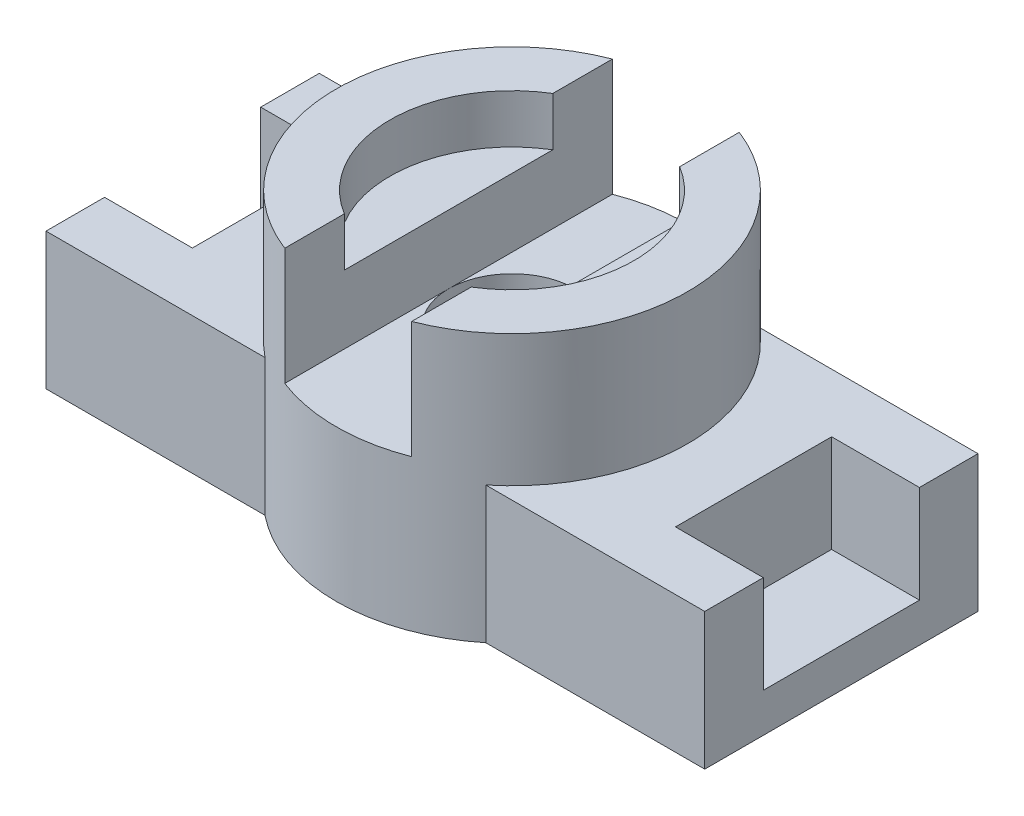
ISO-10303-21;
HEADER;
FILE_DESCRIPTION(('STEP AP214'),'2;1');
FILE_NAME('part.step','',(''),(''),'','','');
FILE_SCHEMA(('AUTOMOTIVE_DESIGN { 1 0 10303 214 1 1 1 1 }'));
ENDSEC;
DATA;
#1=APPLICATION_CONTEXT('core data for automotive mechanical design processes');
#2=APPLICATION_PROTOCOL_DEFINITION('international standard','automotive_design',2000,#1);
#3=PRODUCT_CONTEXT('',#1,'mechanical');
#4=PRODUCT('Part','Part','',(#3));
#5=PRODUCT_RELATED_PRODUCT_CATEGORY('part','',(#4));
#6=PRODUCT_DEFINITION_FORMATION('','',#4);
#7=PRODUCT_DEFINITION_CONTEXT('part definition',#1,'design');
#8=PRODUCT_DEFINITION('design','',#6,#7);
#9=PRODUCT_DEFINITION_SHAPE('','',#8);
#10=(LENGTH_UNIT() NAMED_UNIT(*) SI_UNIT(.MILLI.,.METRE.));
#11=(NAMED_UNIT(*) PLANE_ANGLE_UNIT() SI_UNIT($,.RADIAN.));
#12=(NAMED_UNIT(*) SI_UNIT($,.STERADIAN.) SOLID_ANGLE_UNIT());
#13=UNCERTAINTY_MEASURE_WITH_UNIT(LENGTH_MEASURE(1.E-05),#10,'distance_accuracy_value','');
#14=(GEOMETRIC_REPRESENTATION_CONTEXT(3) GLOBAL_UNCERTAINTY_ASSIGNED_CONTEXT((#13)) GLOBAL_UNIT_ASSIGNED_CONTEXT((#10,
#11,#12)) REPRESENTATION_CONTEXT('',''));
#15=CARTESIAN_POINT('',(0.,0.,0.));
#16=DIRECTION('',(0.,0.,1.));
#17=DIRECTION('',(1.,0.,0.));
#18=AXIS2_PLACEMENT_3D('',#15,#16,#17);
#19=CARTESIAN_POINT('',(0.,55.,0.));
#20=DIRECTION('',(0.,-1.,0.));
#21=DIRECTION('',(0.,0.,-1.));
#22=AXIS2_PLACEMENT_3D('',#19,#20,#21);
#23=CYLINDRICAL_SURFACE('',#22,13.);
#24=CARTESIAN_POINT('',(0.,0.,0.));
#25=DIRECTION('',(0.,1.,0.));
#26=DIRECTION('',(0.,0.,1.));
#27=AXIS2_PLACEMENT_3D('',#24,#25,#26);
#28=CIRCLE('',#27,13.);
#29=CARTESIAN_POINT('',(0.,0.,13.));
#30=VERTEX_POINT('',#29);
#31=EDGE_CURVE('E374',#30,#30,#28,.T.);
#32=ORIENTED_EDGE('',*,*,#31,.F.);
#33=EDGE_LOOP('',(#32));
#34=FACE_BOUND('',#33,.T.);
#35=CARTESIAN_POINT('',(0.,31.,0.));
#36=DIRECTION('',(0.,1.,0.));
#37=DIRECTION('',(0.,0.,1.));
#38=AXIS2_PLACEMENT_3D('',#35,#36,#37);
#39=CIRCLE('',#38,13.);
#40=CARTESIAN_POINT('',(-13.,31.,0.));
#41=VERTEX_POINT('',#40);
#42=CARTESIAN_POINT('',(13.,31.,0.));
#43=VERTEX_POINT('',#42);
#44=EDGE_CURVE('E365',#41,#43,#39,.T.);
#45=ORIENTED_EDGE('',*,*,#44,.T.);
#46=EDGE_CURVE('E369',#43,#41,#39,.T.);
#47=ORIENTED_EDGE('',*,*,#46,.T.);
#48=EDGE_LOOP('',(#45,#47));
#49=FACE_BOUND('',#48,.T.);
#50=ADVANCED_FACE('F80',(#34,#49),#23,.F.);
#51=CARTESIAN_POINT('',(0.,55.,0.));
#52=DIRECTION('',(0.,1.,0.));
#53=DIRECTION('',(0.,0.,1.));
#54=AXIS2_PLACEMENT_3D('',#51,#52,#53);
#55=PLANE('',#54);
#56=CARTESIAN_POINT('',(0.,55.,0.));
#57=DIRECTION('',(0.,1.,0.));
#58=DIRECTION('',(0.,0.,1.));
#59=AXIS2_PLACEMENT_3D('',#56,#57,#58);
#60=CIRCLE('',#59,36.);
#61=CARTESIAN_POINT('',(-13.,55.,-33.570820663189));
#62=VERTEX_POINT('',#61);
#63=CARTESIAN_POINT('',(-13.,55.,33.570820663189));
#64=VERTEX_POINT('',#63);
#65=EDGE_CURVE('E431',#62,#64,#60,.T.);
#66=ORIENTED_EDGE('',*,*,#65,.T.);
#67=DIRECTION('',(0.,0.,-1.));
#68=VECTOR('',#67,1.);
#69=CARTESIAN_POINT('',(-13.,55.,0.));
#70=LINE('',#69,#68);
#71=CARTESIAN_POINT('',(-13.,55.,21.3541565040626));
#72=VERTEX_POINT('',#71);
#73=EDGE_CURVE('E333',#64,#72,#70,.T.);
#74=ORIENTED_EDGE('',*,*,#73,.T.);
#75=CARTESIAN_POINT('',(0.,55.,0.));
#76=DIRECTION('',(0.,1.,0.));
#77=DIRECTION('',(0.,0.,1.));
#78=AXIS2_PLACEMENT_3D('',#75,#76,#77);
#79=CIRCLE('',#78,25.);
#80=CARTESIAN_POINT('',(-13.,55.,-21.3541565040626));
#81=VERTEX_POINT('',#80);
#82=EDGE_CURVE('E380',#81,#72,#79,.T.);
#83=ORIENTED_EDGE('',*,*,#82,.F.);
#84=EDGE_CURVE('E318',#81,#62,#70,.T.);
#85=ORIENTED_EDGE('',*,*,#84,.T.);
#86=EDGE_LOOP('',(#66,#74,#83,#85));
#87=FACE_BOUND('',#86,.T.);
#88=ADVANCED_FACE('F556',(#87),#55,.T.);
#89=CARTESIAN_POINT('',(0.,45.,0.));
#90=DIRECTION('',(0.,1.,0.));
#91=DIRECTION('',(0.,0.,1.));
#92=AXIS2_PLACEMENT_3D('',#89,#90,#91);
#93=CYLINDRICAL_SURFACE('',#92,25.);
#94=DIRECTION('',(0.,1.,0.));
#95=VECTOR('',#94,1.);
#96=CARTESIAN_POINT('',(-13.,45.,-21.3541565040626));
#97=LINE('',#96,#95);
#98=CARTESIAN_POINT('',(-13.,45.,-21.3541565040626));
#99=VERTEX_POINT('',#98);
#100=EDGE_CURVE('E340',#81,#99,#97,.F.);
#101=ORIENTED_EDGE('',*,*,#100,.F.);
#102=ORIENTED_EDGE('',*,*,#82,.T.);
#103=DIRECTION('',(0.,1.,0.));
#104=VECTOR('',#103,1.);
#105=CARTESIAN_POINT('',(-13.,45.,21.3541565040626));
#106=LINE('',#105,#104);
#107=CARTESIAN_POINT('',(-13.,45.,21.3541565040626));
#108=VERTEX_POINT('',#107);
#109=EDGE_CURVE('E337',#108,#72,#106,.T.);
#110=ORIENTED_EDGE('',*,*,#109,.F.);
#111=CARTESIAN_POINT('',(0.,45.,0.));
#112=DIRECTION('',(0.,1.,0.));
#113=DIRECTION('',(0.,0.,1.));
#114=AXIS2_PLACEMENT_3D('',#111,#112,#113);
#115=CIRCLE('',#114,25.);
#116=EDGE_CURVE('E375',#99,#108,#115,.T.);
#117=ORIENTED_EDGE('',*,*,#116,.F.);
#118=EDGE_LOOP('',(#101,#102,#110,#117));
#119=FACE_BOUND('',#118,.T.);
#120=ADVANCED_FACE('F563',(#119),#93,.F.);
#121=CARTESIAN_POINT('',(0.,45.,0.));
#122=DIRECTION('',(0.,1.,0.));
#123=DIRECTION('',(0.,0.,1.));
#124=AXIS2_PLACEMENT_3D('',#121,#122,#123);
#125=PLANE('',#124);
#126=ORIENTED_EDGE('',*,*,#116,.T.);
#127=DIRECTION('',(0.,0.,-1.));
#128=VECTOR('',#127,1.);
#129=CARTESIAN_POINT('',(-13.,45.,0.));
#130=LINE('',#129,#128);
#131=EDGE_CURVE('E476',#108,#99,#130,.T.);
#132=ORIENTED_EDGE('',*,*,#131,.T.);
#133=EDGE_LOOP('',(#126,#132));
#134=FACE_BOUND('',#133,.T.);
#135=ADVANCED_FACE('F567',(#134),#125,.T.);
#136=CARTESIAN_POINT('',(0.,55.,0.));
#137=DIRECTION('',(0.,-1.,0.));
#138=DIRECTION('',(0.,0.,-1.));
#139=AXIS2_PLACEMENT_3D('',#136,#137,#138);
#140=CYLINDRICAL_SURFACE('',#139,36.);
#141=CARTESIAN_POINT('',(0.,31.,0.));
#142=DIRECTION('',(0.,1.,0.));
#143=DIRECTION('',(0.,0.,1.));
#144=AXIS2_PLACEMENT_3D('',#141,#142,#143);
#145=CIRCLE('',#144,36.);
#146=CARTESIAN_POINT('',(13.,31.,-33.570820663189));
#147=VERTEX_POINT('',#146);
#148=CARTESIAN_POINT('',(-13.,31.,-33.570820663189));
#149=VERTEX_POINT('',#148);
#150=EDGE_CURVE('E486',#147,#149,#145,.T.);
#151=ORIENTED_EDGE('',*,*,#150,.F.);
#152=DIRECTION('',(0.,-1.,0.));
#153=VECTOR('',#152,1.);
#154=CARTESIAN_POINT('',(13.,55.,-33.570820663189));
#155=LINE('',#154,#153);
#156=CARTESIAN_POINT('',(13.,55.,-33.570820663189));
#157=VERTEX_POINT('',#156);
#158=EDGE_CURVE('E357',#147,#157,#155,.F.);
#159=ORIENTED_EDGE('',*,*,#158,.T.);
#160=CARTESIAN_POINT('',(13.,55.,33.570820663189));
#161=VERTEX_POINT('',#160);
#162=EDGE_CURVE('E426',#161,#157,#60,.T.);
#163=ORIENTED_EDGE('',*,*,#162,.F.);
#164=DIRECTION('',(0.,-1.,0.));
#165=VECTOR('',#164,1.);
#166=CARTESIAN_POINT('',(13.,55.,33.570820663189));
#167=LINE('',#166,#165);
#168=CARTESIAN_POINT('',(13.,31.,33.570820663189));
#169=VERTEX_POINT('',#168);
#170=EDGE_CURVE('E361',#161,#169,#167,.T.);
#171=ORIENTED_EDGE('',*,*,#170,.T.);
#172=CARTESIAN_POINT('',(-13.,31.,33.570820663189));
#173=VERTEX_POINT('',#172);
#174=EDGE_CURVE('E483',#173,#169,#145,.T.);
#175=ORIENTED_EDGE('',*,*,#174,.F.);
#176=DIRECTION('',(0.,-1.,0.));
#177=VECTOR('',#176,1.);
#178=CARTESIAN_POINT('',(-13.,55.,33.570820663189));
#179=LINE('',#178,#177);
#180=EDGE_CURVE('E346',#64,#173,#179,.T.);
#181=ORIENTED_EDGE('',*,*,#180,.F.);
#182=ORIENTED_EDGE('',*,*,#65,.F.);
#183=DIRECTION('',(0.,-1.,0.));
#184=VECTOR('',#183,1.);
#185=CARTESIAN_POINT('',(-13.,55.,-33.570820663189));
#186=LINE('',#185,#184);
#187=EDGE_CURVE('E343',#149,#62,#186,.F.);
#188=ORIENTED_EDGE('',*,*,#187,.F.);
#189=EDGE_LOOP('',(#151,#159,#163,#171,#175,#181,#182,#188));
#190=FACE_BOUND('',#189,.T.);
#191=DIRECTION('',(0.,-1.,0.));
#192=VECTOR('',#191,1.);
#193=CARTESIAN_POINT('',(22.6274169979695,28.,28.));
#194=LINE('',#193,#192);
#195=CARTESIAN_POINT('',(22.6274169979695,28.,28.));
#196=VERTEX_POINT('',#195);
#197=CARTESIAN_POINT('',(22.6274169979695,0.,28.));
#198=VERTEX_POINT('',#197);
#199=EDGE_CURVE('E421',#196,#198,#194,.T.);
#200=ORIENTED_EDGE('',*,*,#199,.F.);
#201=CARTESIAN_POINT('',(0.,28.,0.));
#202=DIRECTION('',(0.,1.,0.));
#203=DIRECTION('',(0.,0.,1.));
#204=AXIS2_PLACEMENT_3D('',#201,#202,#203);
#205=CIRCLE('',#204,36.);
#206=CARTESIAN_POINT('',(22.6274169979695,28.,-28.));
#207=VERTEX_POINT('',#206);
#208=EDGE_CURVE('E385',#196,#207,#205,.T.);
#209=ORIENTED_EDGE('',*,*,#208,.T.);
#210=DIRECTION('',(0.,-1.,0.));
#211=VECTOR('',#210,1.);
#212=CARTESIAN_POINT('',(22.6274169979695,28.,-28.));
#213=LINE('',#212,#211);
#214=CARTESIAN_POINT('',(22.6274169979695,0.,-28.));
#215=VERTEX_POINT('',#214);
#216=EDGE_CURVE('E401',#207,#215,#213,.T.);
#217=ORIENTED_EDGE('',*,*,#216,.T.);
#218=CARTESIAN_POINT('',(0.,0.,0.));
#219=DIRECTION('',(0.,1.,0.));
#220=DIRECTION('',(0.,0.,1.));
#221=AXIS2_PLACEMENT_3D('',#218,#219,#220);
#222=CIRCLE('',#221,36.);
#223=CARTESIAN_POINT('',(-22.6274169979695,0.,-28.));
#224=VERTEX_POINT('',#223);
#225=EDGE_CURVE('E425',#215,#224,#222,.T.);
#226=ORIENTED_EDGE('',*,*,#225,.T.);
#227=DIRECTION('',(0.,-1.,0.));
#228=VECTOR('',#227,1.);
#229=CARTESIAN_POINT('',(-22.6274169979695,28.,-28.));
#230=LINE('',#229,#228);
#231=CARTESIAN_POINT('',(-22.6274169979695,28.,-28.));
#232=VERTEX_POINT('',#231);
#233=EDGE_CURVE('E472',#232,#224,#230,.T.);
#234=ORIENTED_EDGE('',*,*,#233,.F.);
#235=CARTESIAN_POINT('',(0.,28.,0.));
#236=DIRECTION('',(0.,1.,0.));
#237=DIRECTION('',(0.,0.,1.));
#238=AXIS2_PLACEMENT_3D('',#235,#236,#237);
#239=CIRCLE('',#238,36.);
#240=CARTESIAN_POINT('',(-22.6274169979695,28.,28.));
#241=VERTEX_POINT('',#240);
#242=EDGE_CURVE('E435',#232,#241,#239,.T.);
#243=ORIENTED_EDGE('',*,*,#242,.T.);
#244=DIRECTION('',(0.,-1.,0.));
#245=VECTOR('',#244,1.);
#246=CARTESIAN_POINT('',(-22.6274169979695,28.,28.));
#247=LINE('',#246,#245);
#248=CARTESIAN_POINT('',(-22.6274169979695,0.,28.));
#249=VERTEX_POINT('',#248);
#250=EDGE_CURVE('E452',#241,#249,#247,.T.);
#251=ORIENTED_EDGE('',*,*,#250,.T.);
#252=EDGE_CURVE('E432',#249,#198,#222,.T.);
#253=ORIENTED_EDGE('',*,*,#252,.T.);
#254=EDGE_LOOP('',(#200,#209,#217,#226,#234,#243,#251,#253));
#255=FACE_BOUND('',#254,.T.);
#256=ADVANCED_FACE('F513',(#190,#255),#140,.T.);
#257=CARTESIAN_POINT('',(0.,28.,-28.));
#258=DIRECTION('',(0.,0.,-1.));
#259=DIRECTION('',(-1.,0.,0.));
#260=AXIS2_PLACEMENT_3D('',#257,#258,#259);
#261=PLANE('',#260);
#262=DIRECTION('',(1.,0.,0.));
#263=VECTOR('',#262,1.);
#264=CARTESIAN_POINT('',(0.,0.,-28.));
#265=LINE('',#264,#263);
#266=CARTESIAN_POINT('',(-67.5,0.,-28.));
#267=VERTEX_POINT('',#266);
#268=EDGE_CURVE('E430',#267,#224,#265,.T.);
#269=ORIENTED_EDGE('',*,*,#268,.F.);
#270=DIRECTION('',(0.,-1.,0.));
#271=VECTOR('',#270,1.);
#272=CARTESIAN_POINT('',(-67.5,28.,-28.));
#273=LINE('',#272,#271);
#274=CARTESIAN_POINT('',(-67.5,28.,-28.));
#275=VERTEX_POINT('',#274);
#276=EDGE_CURVE('E469',#275,#267,#273,.T.);
#277=ORIENTED_EDGE('',*,*,#276,.F.);
#278=DIRECTION('',(1.,0.,0.));
#279=VECTOR('',#278,1.);
#280=CARTESIAN_POINT('',(0.,28.,-28.));
#281=LINE('',#280,#279);
#282=EDGE_CURVE('E438',#275,#232,#281,.T.);
#283=ORIENTED_EDGE('',*,*,#282,.T.);
#284=ORIENTED_EDGE('',*,*,#233,.T.);
#285=EDGE_LOOP('',(#269,#277,#283,#284));
#286=FACE_BOUND('',#285,.T.);
#287=ADVANCED_FACE('F82',(#286),#261,.T.);
#288=CARTESIAN_POINT('',(-67.5,28.,0.));
#289=DIRECTION('',(-1.,0.,0.));
#290=DIRECTION('',(0.,0.,1.));
#291=AXIS2_PLACEMENT_3D('',#288,#289,#290);
#292=PLANE('',#291);
#293=DIRECTION('',(0.,1.,0.));
#294=VECTOR('',#293,1.);
#295=CARTESIAN_POINT('',(-67.5,28.,16.));
#296=LINE('',#295,#294);
#297=CARTESIAN_POINT('',(-67.5,8.,16.));
#298=VERTEX_POINT('',#297);
#299=CARTESIAN_POINT('',(-67.5,28.,16.));
#300=VERTEX_POINT('',#299);
#301=EDGE_CURVE('E315',#298,#300,#296,.T.);
#302=ORIENTED_EDGE('',*,*,#301,.F.);
#303=DIRECTION('',(0.,0.,-1.));
#304=VECTOR('',#303,1.);
#305=CARTESIAN_POINT('',(-67.5,8.,0.));
#306=LINE('',#305,#304);
#307=CARTESIAN_POINT('',(-67.5,8.,-16.));
#308=VERTEX_POINT('',#307);
#309=EDGE_CURVE('E12',#298,#308,#306,.T.);
#310=ORIENTED_EDGE('',*,*,#309,.T.);
#311=DIRECTION('',(0.,-1.,0.));
#312=VECTOR('',#311,1.);
#313=CARTESIAN_POINT('',(-67.5,28.,-16.));
#314=LINE('',#313,#312);
#315=CARTESIAN_POINT('',(-67.5,28.,-16.));
#316=VERTEX_POINT('',#315);
#317=EDGE_CURVE('E263',#316,#308,#314,.T.);
#318=ORIENTED_EDGE('',*,*,#317,.F.);
#319=DIRECTION('',(0.,0.,-1.));
#320=VECTOR('',#319,1.);
#321=CARTESIAN_POINT('',(-67.5,28.,0.));
#322=LINE('',#321,#320);
#323=EDGE_CURVE('E443',#316,#275,#322,.T.);
#324=ORIENTED_EDGE('',*,*,#323,.T.);
#325=ORIENTED_EDGE('',*,*,#276,.T.);
#326=DIRECTION('',(0.,0.,-1.));
#327=VECTOR('',#326,1.);
#328=CARTESIAN_POINT('',(-67.5,0.,0.));
#329=LINE('',#328,#327);
#330=CARTESIAN_POINT('',(-67.5,0.,28.));
#331=VERTEX_POINT('',#330);
#332=EDGE_CURVE('E456',#331,#267,#329,.T.);
#333=ORIENTED_EDGE('',*,*,#332,.F.);
#334=DIRECTION('',(0.,-1.,0.));
#335=VECTOR('',#334,1.);
#336=CARTESIAN_POINT('',(-67.5,28.,28.));
#337=LINE('',#336,#335);
#338=CARTESIAN_POINT('',(-67.5,28.,28.));
#339=VERTEX_POINT('',#338);
#340=EDGE_CURVE('E466',#339,#331,#337,.T.);
#341=ORIENTED_EDGE('',*,*,#340,.F.);
#342=EDGE_CURVE('E444',#339,#300,#322,.T.);
#343=ORIENTED_EDGE('',*,*,#342,.T.);
#344=EDGE_LOOP('',(#302,#310,#318,#324,#325,#333,#341,#343));
#345=FACE_BOUND('',#344,.T.);
#346=ADVANCED_FACE('F503',(#345),#292,.T.);
#347=CARTESIAN_POINT('',(0.,28.,28.));
#348=DIRECTION('',(0.,0.,-1.));
#349=DIRECTION('',(-1.,0.,0.));
#350=AXIS2_PLACEMENT_3D('',#347,#348,#349);
#351=PLANE('',#350);
#352=DIRECTION('',(1.,0.,0.));
#353=VECTOR('',#352,1.);
#354=CARTESIAN_POINT('',(0.,0.,28.));
#355=LINE('',#354,#353);
#356=EDGE_CURVE('E439',#331,#249,#355,.T.);
#357=ORIENTED_EDGE('',*,*,#356,.T.);
#358=ORIENTED_EDGE('',*,*,#250,.F.);
#359=DIRECTION('',(1.,0.,0.));
#360=VECTOR('',#359,1.);
#361=CARTESIAN_POINT('',(0.,28.,28.));
#362=LINE('',#361,#360);
#363=EDGE_CURVE('E448',#339,#241,#362,.T.);
#364=ORIENTED_EDGE('',*,*,#363,.F.);
#365=ORIENTED_EDGE('',*,*,#340,.T.);
#366=EDGE_LOOP('',(#357,#358,#364,#365));
#367=FACE_BOUND('',#366,.T.);
#368=ADVANCED_FACE('F510',(#367),#351,.F.);
#369=CARTESIAN_POINT('',(0.,28.,0.));
#370=DIRECTION('',(0.,1.,0.));
#371=DIRECTION('',(0.,0.,1.));
#372=AXIS2_PLACEMENT_3D('',#369,#370,#371);
#373=PLANE('',#372);
#374=DIRECTION('',(1.,0.,0.));
#375=VECTOR('',#374,1.);
#376=CARTESIAN_POINT('',(0.,28.,16.));
#377=LINE('',#376,#375);
#378=CARTESIAN_POINT('',(-49.5,28.,16.));
#379=VERTEX_POINT('',#378);
#380=EDGE_CURVE('E89',#300,#379,#377,.T.);
#381=ORIENTED_EDGE('',*,*,#380,.F.);
#382=ORIENTED_EDGE('',*,*,#342,.F.);
#383=ORIENTED_EDGE('',*,*,#363,.T.);
#384=ORIENTED_EDGE('',*,*,#242,.F.);
#385=ORIENTED_EDGE('',*,*,#282,.F.);
#386=ORIENTED_EDGE('',*,*,#323,.F.);
#387=DIRECTION('',(-1.,0.,0.));
#388=VECTOR('',#387,1.);
#389=CARTESIAN_POINT('',(-49.5,28.,-16.));
#390=LINE('',#389,#388);
#391=CARTESIAN_POINT('',(-49.5,28.,-16.));
#392=VERTEX_POINT('',#391);
#393=EDGE_CURVE('E271',#392,#316,#390,.T.);
#394=ORIENTED_EDGE('',*,*,#393,.F.);
#395=DIRECTION('',(0.,0.,-1.));
#396=VECTOR('',#395,1.);
#397=CARTESIAN_POINT('',(-49.5,28.,16.));
#398=LINE('',#397,#396);
#399=EDGE_CURVE('E96',#379,#392,#398,.T.);
#400=ORIENTED_EDGE('',*,*,#399,.F.);
#401=EDGE_LOOP('',(#381,#382,#383,#384,#385,#386,#394,#400));
#402=FACE_BOUND('',#401,.T.);
#403=ADVANCED_FACE('F499',(#402),#373,.T.);
#404=CARTESIAN_POINT('',(0.,0.,0.));
#405=DIRECTION('',(0.,1.,0.));
#406=DIRECTION('',(0.,0.,1.));
#407=AXIS2_PLACEMENT_3D('',#404,#405,#406);
#408=PLANE('',#407);
#409=ORIENTED_EDGE('',*,*,#31,.T.);
#410=EDGE_LOOP('',(#409));
#411=FACE_BOUND('',#410,.T.);
#412=ORIENTED_EDGE('',*,*,#268,.T.);
#413=ORIENTED_EDGE('',*,*,#225,.F.);
#414=DIRECTION('',(1.,0.,0.));
#415=VECTOR('',#414,1.);
#416=CARTESIAN_POINT('',(0.,0.,-28.));
#417=LINE('',#416,#415);
#418=CARTESIAN_POINT('',(67.5,0.,-28.));
#419=VERTEX_POINT('',#418);
#420=EDGE_CURVE('E389',#215,#419,#417,.T.);
#421=ORIENTED_EDGE('',*,*,#420,.T.);
#422=DIRECTION('',(0.,0.,-1.));
#423=VECTOR('',#422,1.);
#424=CARTESIAN_POINT('',(67.5,0.,0.));
#425=LINE('',#424,#423);
#426=CARTESIAN_POINT('',(67.5,0.,28.));
#427=VERTEX_POINT('',#426);
#428=EDGE_CURVE('E404',#427,#419,#425,.T.);
#429=ORIENTED_EDGE('',*,*,#428,.F.);
#430=DIRECTION('',(1.,0.,0.));
#431=VECTOR('',#430,1.);
#432=CARTESIAN_POINT('',(0.,0.,28.));
#433=LINE('',#432,#431);
#434=EDGE_CURVE('E384',#198,#427,#433,.T.);
#435=ORIENTED_EDGE('',*,*,#434,.F.);
#436=ORIENTED_EDGE('',*,*,#252,.F.);
#437=ORIENTED_EDGE('',*,*,#356,.F.);
#438=ORIENTED_EDGE('',*,*,#332,.T.);
#439=EDGE_LOOP('',(#412,#413,#421,#429,#435,#436,#437,#438));
#440=FACE_BOUND('',#439,.T.);
#441=ADVANCED_FACE('F517',(#411,#440),#408,.F.);
#442=DIRECTION('',(0.,0.,-1.));
#443=VECTOR('',#442,1.);
#444=CARTESIAN_POINT('',(13.,55.,0.));
#445=LINE('',#444,#443);
#446=CARTESIAN_POINT('',(13.,55.,21.3541565040626));
#447=VERTEX_POINT('',#446);
#448=EDGE_CURVE('E324',#161,#447,#445,.T.);
#449=ORIENTED_EDGE('',*,*,#448,.F.);
#450=ORIENTED_EDGE('',*,*,#162,.T.);
#451=CARTESIAN_POINT('',(13.,55.,-21.3541565040626));
#452=VERTEX_POINT('',#451);
#453=EDGE_CURVE('E334',#452,#157,#445,.T.);
#454=ORIENTED_EDGE('',*,*,#453,.F.);
#455=EDGE_CURVE('E376',#447,#452,#79,.T.);
#456=ORIENTED_EDGE('',*,*,#455,.F.);
#457=EDGE_LOOP('',(#449,#450,#454,#456));
#458=FACE_BOUND('',#457,.T.);
#459=ADVANCED_FACE('F591',(#458),#55,.T.);
#460=CARTESIAN_POINT('',(0.,28.,28.));
#461=DIRECTION('',(0.,0.,-1.));
#462=DIRECTION('',(-1.,0.,0.));
#463=AXIS2_PLACEMENT_3D('',#460,#461,#462);
#464=PLANE('',#463);
#465=ORIENTED_EDGE('',*,*,#434,.T.);
#466=DIRECTION('',(0.,-1.,0.));
#467=VECTOR('',#466,1.);
#468=CARTESIAN_POINT('',(67.5,28.,28.));
#469=LINE('',#468,#467);
#470=CARTESIAN_POINT('',(67.5,28.,28.));
#471=VERTEX_POINT('',#470);
#472=EDGE_CURVE('E417',#471,#427,#469,.T.);
#473=ORIENTED_EDGE('',*,*,#472,.F.);
#474=DIRECTION('',(1.,0.,0.));
#475=VECTOR('',#474,1.);
#476=CARTESIAN_POINT('',(0.,28.,28.));
#477=LINE('',#476,#475);
#478=EDGE_CURVE('E388',#196,#471,#477,.T.);
#479=ORIENTED_EDGE('',*,*,#478,.F.);
#480=ORIENTED_EDGE('',*,*,#199,.T.);
#481=EDGE_LOOP('',(#465,#473,#479,#480));
#482=FACE_BOUND('',#481,.T.);
#483=ADVANCED_FACE('F522',(#482),#464,.F.);
#484=CARTESIAN_POINT('',(67.5,28.,0.));
#485=DIRECTION('',(-1.,0.,0.));
#486=DIRECTION('',(0.,0.,1.));
#487=AXIS2_PLACEMENT_3D('',#484,#485,#486);
#488=PLANE('',#487);
#489=DIRECTION('',(0.,0.,-1.));
#490=VECTOR('',#489,1.);
#491=CARTESIAN_POINT('',(67.5,8.,0.));
#492=LINE('',#491,#490);
#493=CARTESIAN_POINT('',(67.5,8.,16.));
#494=VERTEX_POINT('',#493);
#495=CARTESIAN_POINT('',(67.5,8.,-16.));
#496=VERTEX_POINT('',#495);
#497=EDGE_CURVE('E490',#494,#496,#492,.T.);
#498=ORIENTED_EDGE('',*,*,#497,.F.);
#499=DIRECTION('',(0.,1.,0.));
#500=VECTOR('',#499,1.);
#501=CARTESIAN_POINT('',(67.5,28.,16.));
#502=LINE('',#501,#500);
#503=CARTESIAN_POINT('',(67.5,28.,16.));
#504=VERTEX_POINT('',#503);
#505=EDGE_CURVE('E309',#494,#504,#502,.T.);
#506=ORIENTED_EDGE('',*,*,#505,.T.);
#507=DIRECTION('',(0.,0.,-1.));
#508=VECTOR('',#507,1.);
#509=CARTESIAN_POINT('',(67.5,28.,0.));
#510=LINE('',#509,#508);
#511=EDGE_CURVE('E393',#471,#504,#510,.T.);
#512=ORIENTED_EDGE('',*,*,#511,.F.);
#513=ORIENTED_EDGE('',*,*,#472,.T.);
#514=ORIENTED_EDGE('',*,*,#428,.T.);
#515=DIRECTION('',(0.,-1.,0.));
#516=VECTOR('',#515,1.);
#517=CARTESIAN_POINT('',(67.5,28.,-28.));
#518=LINE('',#517,#516);
#519=CARTESIAN_POINT('',(67.5,28.,-28.));
#520=VERTEX_POINT('',#519);
#521=EDGE_CURVE('E414',#520,#419,#518,.T.);
#522=ORIENTED_EDGE('',*,*,#521,.F.);
#523=CARTESIAN_POINT('',(67.5,28.,-16.));
#524=VERTEX_POINT('',#523);
#525=EDGE_CURVE('E392',#524,#520,#510,.T.);
#526=ORIENTED_EDGE('',*,*,#525,.F.);
#527=DIRECTION('',(0.,-1.,0.));
#528=VECTOR('',#527,1.);
#529=CARTESIAN_POINT('',(67.5,28.,-16.));
#530=LINE('',#529,#528);
#531=EDGE_CURVE('E104',#524,#496,#530,.T.);
#532=ORIENTED_EDGE('',*,*,#531,.T.);
#533=EDGE_LOOP('',(#498,#506,#512,#513,#514,#522,#526,#532));
#534=FACE_BOUND('',#533,.T.);
#535=ADVANCED_FACE('F527',(#534),#488,.F.);
#536=CARTESIAN_POINT('',(0.,28.,-28.));
#537=DIRECTION('',(0.,0.,-1.));
#538=DIRECTION('',(-1.,0.,0.));
#539=AXIS2_PLACEMENT_3D('',#536,#537,#538);
#540=PLANE('',#539);
#541=ORIENTED_EDGE('',*,*,#420,.F.);
#542=ORIENTED_EDGE('',*,*,#216,.F.);
#543=DIRECTION('',(1.,0.,0.));
#544=VECTOR('',#543,1.);
#545=CARTESIAN_POINT('',(0.,28.,-28.));
#546=LINE('',#545,#544);
#547=EDGE_CURVE('E397',#207,#520,#546,.T.);
#548=ORIENTED_EDGE('',*,*,#547,.T.);
#549=ORIENTED_EDGE('',*,*,#521,.T.);
#550=EDGE_LOOP('',(#541,#542,#548,#549));
#551=FACE_BOUND('',#550,.T.);
#552=ADVANCED_FACE('F538',(#551),#540,.T.);
#553=CARTESIAN_POINT('',(0.,28.,0.));
#554=DIRECTION('',(0.,1.,0.));
#555=DIRECTION('',(0.,0.,1.));
#556=AXIS2_PLACEMENT_3D('',#553,#554,#555);
#557=PLANE('',#556);
#558=DIRECTION('',(1.,0.,0.));
#559=VECTOR('',#558,1.);
#560=CARTESIAN_POINT('',(49.5,28.,16.));
#561=LINE('',#560,#559);
#562=CARTESIAN_POINT('',(49.5,28.,16.));
#563=VERTEX_POINT('',#562);
#564=EDGE_CURVE('E279',#563,#504,#561,.T.);
#565=ORIENTED_EDGE('',*,*,#564,.F.);
#566=DIRECTION('',(0.,0.,1.));
#567=VECTOR('',#566,1.);
#568=CARTESIAN_POINT('',(49.5,28.,16.));
#569=LINE('',#568,#567);
#570=CARTESIAN_POINT('',(49.5,28.,-16.));
#571=VERTEX_POINT('',#570);
#572=EDGE_CURVE('E291',#571,#563,#569,.T.);
#573=ORIENTED_EDGE('',*,*,#572,.F.);
#574=DIRECTION('',(-1.,0.,0.));
#575=VECTOR('',#574,1.);
#576=CARTESIAN_POINT('',(0.,28.,-16.));
#577=LINE('',#576,#575);
#578=EDGE_CURVE('E487',#524,#571,#577,.T.);
#579=ORIENTED_EDGE('',*,*,#578,.F.);
#580=ORIENTED_EDGE('',*,*,#525,.T.);
#581=ORIENTED_EDGE('',*,*,#547,.F.);
#582=ORIENTED_EDGE('',*,*,#208,.F.);
#583=ORIENTED_EDGE('',*,*,#478,.T.);
#584=ORIENTED_EDGE('',*,*,#511,.T.);
#585=EDGE_LOOP('',(#565,#573,#579,#580,#581,#582,#583,#584));
#586=FACE_BOUND('',#585,.T.);
#587=ADVANCED_FACE('F531',(#586),#557,.T.);
#588=ORIENTED_EDGE('',*,*,#455,.T.);
#589=DIRECTION('',(0.,1.,0.));
#590=VECTOR('',#589,1.);
#591=CARTESIAN_POINT('',(13.,45.,-21.3541565040626));
#592=LINE('',#591,#590);
#593=CARTESIAN_POINT('',(13.,45.,-21.3541565040626));
#594=VERTEX_POINT('',#593);
#595=EDGE_CURVE('E353',#452,#594,#592,.F.);
#596=ORIENTED_EDGE('',*,*,#595,.T.);
#597=CARTESIAN_POINT('',(13.,45.,21.3541565040626));
#598=VERTEX_POINT('',#597);
#599=EDGE_CURVE('E370',#598,#594,#115,.T.);
#600=ORIENTED_EDGE('',*,*,#599,.F.);
#601=DIRECTION('',(0.,1.,0.));
#602=VECTOR('',#601,1.);
#603=CARTESIAN_POINT('',(13.,45.,21.3541565040626));
#604=LINE('',#603,#602);
#605=EDGE_CURVE('E349',#598,#447,#604,.T.);
#606=ORIENTED_EDGE('',*,*,#605,.T.);
#607=EDGE_LOOP('',(#588,#596,#600,#606));
#608=FACE_BOUND('',#607,.T.);
#609=ADVANCED_FACE('F578',(#608),#93,.F.);
#610=DIRECTION('',(0.,0.,-1.));
#611=VECTOR('',#610,1.);
#612=CARTESIAN_POINT('',(13.,45.,0.));
#613=LINE('',#612,#611);
#614=EDGE_CURVE('E480',#598,#594,#613,.T.);
#615=ORIENTED_EDGE('',*,*,#614,.F.);
#616=ORIENTED_EDGE('',*,*,#599,.T.);
#617=EDGE_LOOP('',(#615,#616));
#618=FACE_BOUND('',#617,.T.);
#619=ADVANCED_FACE('F570',(#618),#125,.T.);
#620=CARTESIAN_POINT('',(0.,31.,0.));
#621=DIRECTION('',(0.,1.,0.));
#622=DIRECTION('',(0.,0.,1.));
#623=AXIS2_PLACEMENT_3D('',#620,#621,#622);
#624=PLANE('',#623);
#625=DIRECTION('',(0.,0.,-1.));
#626=VECTOR('',#625,1.);
#627=CARTESIAN_POINT('',(13.,31.,0.));
#628=LINE('',#627,#626);
#629=EDGE_CURVE('E325',#43,#147,#628,.T.);
#630=ORIENTED_EDGE('',*,*,#629,.T.);
#631=ORIENTED_EDGE('',*,*,#150,.T.);
#632=DIRECTION('',(0.,0.,-1.));
#633=VECTOR('',#632,1.);
#634=CARTESIAN_POINT('',(-13.,31.,0.));
#635=LINE('',#634,#633);
#636=EDGE_CURVE('E319',#41,#149,#635,.T.);
#637=ORIENTED_EDGE('',*,*,#636,.F.);
#638=ORIENTED_EDGE('',*,*,#46,.F.);
#639=EDGE_LOOP('',(#630,#631,#637,#638));
#640=FACE_BOUND('',#639,.T.);
#641=ADVANCED_FACE('F581',(#640),#624,.T.);
#642=EDGE_CURVE('E323',#173,#41,#635,.T.);
#643=ORIENTED_EDGE('',*,*,#642,.F.);
#644=ORIENTED_EDGE('',*,*,#174,.T.);
#645=EDGE_CURVE('E329',#169,#43,#628,.T.);
#646=ORIENTED_EDGE('',*,*,#645,.T.);
#647=ORIENTED_EDGE('',*,*,#44,.F.);
#648=EDGE_LOOP('',(#643,#644,#646,#647));
#649=FACE_BOUND('',#648,.T.);
#650=ADVANCED_FACE('F720',(#649),#624,.T.);
#651=CARTESIAN_POINT('',(13.,31.,0.));
#652=DIRECTION('',(1.,0.,0.));
#653=DIRECTION('',(0.,0.,-1.));
#654=AXIS2_PLACEMENT_3D('',#651,#652,#653);
#655=PLANE('',#654);
#656=ORIENTED_EDGE('',*,*,#614,.T.);
#657=ORIENTED_EDGE('',*,*,#595,.F.);
#658=ORIENTED_EDGE('',*,*,#453,.T.);
#659=ORIENTED_EDGE('',*,*,#158,.F.);
#660=ORIENTED_EDGE('',*,*,#629,.F.);
#661=ORIENTED_EDGE('',*,*,#645,.F.);
#662=ORIENTED_EDGE('',*,*,#170,.F.);
#663=ORIENTED_EDGE('',*,*,#448,.T.);
#664=ORIENTED_EDGE('',*,*,#605,.F.);
#665=EDGE_LOOP('',(#656,#657,#658,#659,#660,#661,#662,#663,#664));
#666=FACE_BOUND('',#665,.T.);
#667=ADVANCED_FACE('F733',(#666),#655,.F.);
#668=CARTESIAN_POINT('',(-13.,31.,0.));
#669=DIRECTION('',(1.,0.,0.));
#670=DIRECTION('',(0.,0.,-1.));
#671=AXIS2_PLACEMENT_3D('',#668,#669,#670);
#672=PLANE('',#671);
#673=ORIENTED_EDGE('',*,*,#131,.F.);
#674=ORIENTED_EDGE('',*,*,#109,.T.);
#675=ORIENTED_EDGE('',*,*,#73,.F.);
#676=ORIENTED_EDGE('',*,*,#180,.T.);
#677=ORIENTED_EDGE('',*,*,#642,.T.);
#678=ORIENTED_EDGE('',*,*,#636,.T.);
#679=ORIENTED_EDGE('',*,*,#187,.T.);
#680=ORIENTED_EDGE('',*,*,#84,.F.);
#681=ORIENTED_EDGE('',*,*,#100,.T.);
#682=EDGE_LOOP('',(#673,#674,#675,#676,#677,#678,#679,#680,#681));
#683=FACE_BOUND('',#682,.T.);
#684=ADVANCED_FACE('F565',(#683),#672,.T.);
#685=CARTESIAN_POINT('',(0.,8.,0.));
#686=DIRECTION('',(0.,1.,0.));
#687=DIRECTION('',(0.,0.,1.));
#688=AXIS2_PLACEMENT_3D('',#685,#686,#687);
#689=PLANE('',#688);
#690=ORIENTED_EDGE('',*,*,#497,.T.);
#691=DIRECTION('',(-1.,0.,0.));
#692=VECTOR('',#691,1.);
#693=CARTESIAN_POINT('',(49.5,8.,-16.));
#694=LINE('',#693,#692);
#695=CARTESIAN_POINT('',(49.5,8.,-16.));
#696=VERTEX_POINT('',#695);
#697=EDGE_CURVE('E301',#496,#696,#694,.T.);
#698=ORIENTED_EDGE('',*,*,#697,.T.);
#699=DIRECTION('',(0.,0.,1.));
#700=VECTOR('',#699,1.);
#701=CARTESIAN_POINT('',(49.5,8.,16.));
#702=LINE('',#701,#700);
#703=CARTESIAN_POINT('',(49.5,8.,16.));
#704=VERTEX_POINT('',#703);
#705=EDGE_CURVE('E287',#696,#704,#702,.T.);
#706=ORIENTED_EDGE('',*,*,#705,.T.);
#707=DIRECTION('',(1.,0.,0.));
#708=VECTOR('',#707,1.);
#709=CARTESIAN_POINT('',(49.5,8.,16.));
#710=LINE('',#709,#708);
#711=EDGE_CURVE('E295',#704,#494,#710,.T.);
#712=ORIENTED_EDGE('',*,*,#711,.T.);
#713=EDGE_LOOP('',(#690,#698,#706,#712));
#714=FACE_BOUND('',#713,.T.);
#715=ADVANCED_FACE('F756',(#714),#689,.T.);
#716=CARTESIAN_POINT('',(49.5,8.,16.));
#717=DIRECTION('',(0.,0.,1.));
#718=DIRECTION('',(1.,0.,0.));
#719=AXIS2_PLACEMENT_3D('',#716,#717,#718);
#720=PLANE('',#719);
#721=ORIENTED_EDGE('',*,*,#711,.F.);
#722=DIRECTION('',(0.,1.,0.));
#723=VECTOR('',#722,1.);
#724=CARTESIAN_POINT('',(49.5,8.,16.));
#725=LINE('',#724,#723);
#726=EDGE_CURVE('E288',#704,#563,#725,.T.);
#727=ORIENTED_EDGE('',*,*,#726,.T.);
#728=ORIENTED_EDGE('',*,*,#564,.T.);
#729=ORIENTED_EDGE('',*,*,#505,.F.);
#730=EDGE_LOOP('',(#721,#727,#728,#729));
#731=FACE_BOUND('',#730,.T.);
#732=ADVANCED_FACE('F767',(#731),#720,.F.);
#733=CARTESIAN_POINT('',(49.5,8.,-16.));
#734=DIRECTION('',(0.,0.,-1.));
#735=DIRECTION('',(-1.,0.,0.));
#736=AXIS2_PLACEMENT_3D('',#733,#734,#735);
#737=PLANE('',#736);
#738=ORIENTED_EDGE('',*,*,#578,.T.);
#739=DIRECTION('',(0.,1.,0.));
#740=VECTOR('',#739,1.);
#741=CARTESIAN_POINT('',(49.5,8.,-16.));
#742=LINE('',#741,#740);
#743=EDGE_CURVE('E283',#696,#571,#742,.T.);
#744=ORIENTED_EDGE('',*,*,#743,.F.);
#745=ORIENTED_EDGE('',*,*,#697,.F.);
#746=ORIENTED_EDGE('',*,*,#531,.F.);
#747=EDGE_LOOP('',(#738,#744,#745,#746));
#748=FACE_BOUND('',#747,.T.);
#749=ADVANCED_FACE('F777',(#748),#737,.F.);
#750=CARTESIAN_POINT('',(49.5,8.,16.));
#751=DIRECTION('',(-1.,0.,0.));
#752=DIRECTION('',(0.,0.,1.));
#753=AXIS2_PLACEMENT_3D('',#750,#751,#752);
#754=PLANE('',#753);
#755=ORIENTED_EDGE('',*,*,#572,.T.);
#756=ORIENTED_EDGE('',*,*,#726,.F.);
#757=ORIENTED_EDGE('',*,*,#705,.F.);
#758=ORIENTED_EDGE('',*,*,#743,.T.);
#759=EDGE_LOOP('',(#755,#756,#757,#758));
#760=FACE_BOUND('',#759,.T.);
#761=ADVANCED_FACE('F787',(#760),#754,.F.);
#762=CARTESIAN_POINT('',(-49.5,8.,16.));
#763=DIRECTION('',(1.,0.,0.));
#764=DIRECTION('',(0.,0.,-1.));
#765=AXIS2_PLACEMENT_3D('',#762,#763,#764);
#766=PLANE('',#765);
#767=ORIENTED_EDGE('',*,*,#399,.T.);
#768=DIRECTION('',(0.,1.,0.));
#769=VECTOR('',#768,1.);
#770=CARTESIAN_POINT('',(-49.5,8.,-16.));
#771=LINE('',#770,#769);
#772=CARTESIAN_POINT('',(-49.5,8.,-16.));
#773=VERTEX_POINT('',#772);
#774=EDGE_CURVE('E248',#773,#392,#771,.T.);
#775=ORIENTED_EDGE('',*,*,#774,.F.);
#776=DIRECTION('',(0.,0.,-1.));
#777=VECTOR('',#776,1.);
#778=CARTESIAN_POINT('',(-49.5,8.,16.));
#779=LINE('',#778,#777);
#780=CARTESIAN_POINT('',(-49.5,8.,16.));
#781=VERTEX_POINT('',#780);
#782=EDGE_CURVE('E252',#781,#773,#779,.T.);
#783=ORIENTED_EDGE('',*,*,#782,.F.);
#784=DIRECTION('',(0.,1.,0.));
#785=VECTOR('',#784,1.);
#786=CARTESIAN_POINT('',(-49.5,8.,16.));
#787=LINE('',#786,#785);
#788=EDGE_CURVE('E256',#781,#379,#787,.T.);
#789=ORIENTED_EDGE('',*,*,#788,.T.);
#790=EDGE_LOOP('',(#767,#775,#783,#789));
#791=FACE_BOUND('',#790,.T.);
#792=ADVANCED_FACE('F250',(#791),#766,.F.);
#793=CARTESIAN_POINT('',(-49.5,8.,16.));
#794=DIRECTION('',(0.,0.,1.));
#795=DIRECTION('',(1.,0.,0.));
#796=AXIS2_PLACEMENT_3D('',#793,#794,#795);
#797=PLANE('',#796);
#798=ORIENTED_EDGE('',*,*,#301,.T.);
#799=ORIENTED_EDGE('',*,*,#380,.T.);
#800=ORIENTED_EDGE('',*,*,#788,.F.);
#801=DIRECTION('',(1.,0.,0.));
#802=VECTOR('',#801,1.);
#803=CARTESIAN_POINT('',(-49.5,8.,16.));
#804=LINE('',#803,#802);
#805=EDGE_CURVE('E257',#298,#781,#804,.T.);
#806=ORIENTED_EDGE('',*,*,#805,.F.);
#807=EDGE_LOOP('',(#798,#799,#800,#806));
#808=FACE_BOUND('',#807,.T.);
#809=ADVANCED_FACE('F495',(#808),#797,.F.);
#810=CARTESIAN_POINT('',(-49.5,8.,-16.));
#811=DIRECTION('',(0.,0.,-1.));
#812=DIRECTION('',(-1.,0.,0.));
#813=AXIS2_PLACEMENT_3D('',#810,#811,#812);
#814=PLANE('',#813);
#815=ORIENTED_EDGE('',*,*,#317,.T.);
#816=DIRECTION('',(-1.,0.,0.));
#817=VECTOR('',#816,1.);
#818=CARTESIAN_POINT('',(-49.5,8.,-16.));
#819=LINE('',#818,#817);
#820=EDGE_CURVE('E260',#773,#308,#819,.T.);
#821=ORIENTED_EDGE('',*,*,#820,.F.);
#822=ORIENTED_EDGE('',*,*,#774,.T.);
#823=ORIENTED_EDGE('',*,*,#393,.T.);
#824=EDGE_LOOP('',(#815,#821,#822,#823));
#825=FACE_BOUND('',#824,.T.);
#826=ADVANCED_FACE('F261',(#825),#814,.F.);
#827=CARTESIAN_POINT('',(0.,8.,0.));
#828=DIRECTION('',(0.,1.,0.));
#829=DIRECTION('',(0.,0.,1.));
#830=AXIS2_PLACEMENT_3D('',#827,#828,#829);
#831=PLANE('',#830);
#832=ORIENTED_EDGE('',*,*,#805,.T.);
#833=ORIENTED_EDGE('',*,*,#782,.T.);
#834=ORIENTED_EDGE('',*,*,#820,.T.);
#835=ORIENTED_EDGE('',*,*,#309,.F.);
#836=EDGE_LOOP('',(#832,#833,#834,#835));
#837=FACE_BOUND('',#836,.T.);
#838=ADVANCED_FACE('F267',(#837),#831,.T.);
#839=CLOSED_SHELL('',(#50,#88,#120,#135,#256,#287,#346,#368,#403,#441,#459,#483,#535,#552,#587,
#609,#619,#641,#650,#667,#684,#715,#732,#749,#761,#792,#809,#826,#838));
#840=MANIFOLD_SOLID_BREP('B2',#839);
#841=ADVANCED_BREP_SHAPE_REPRESENTATION('',(#18,#840),#14);
#842=SHAPE_DEFINITION_REPRESENTATION(#9,#841);
ENDSEC;
END-ISO-10303-21;
